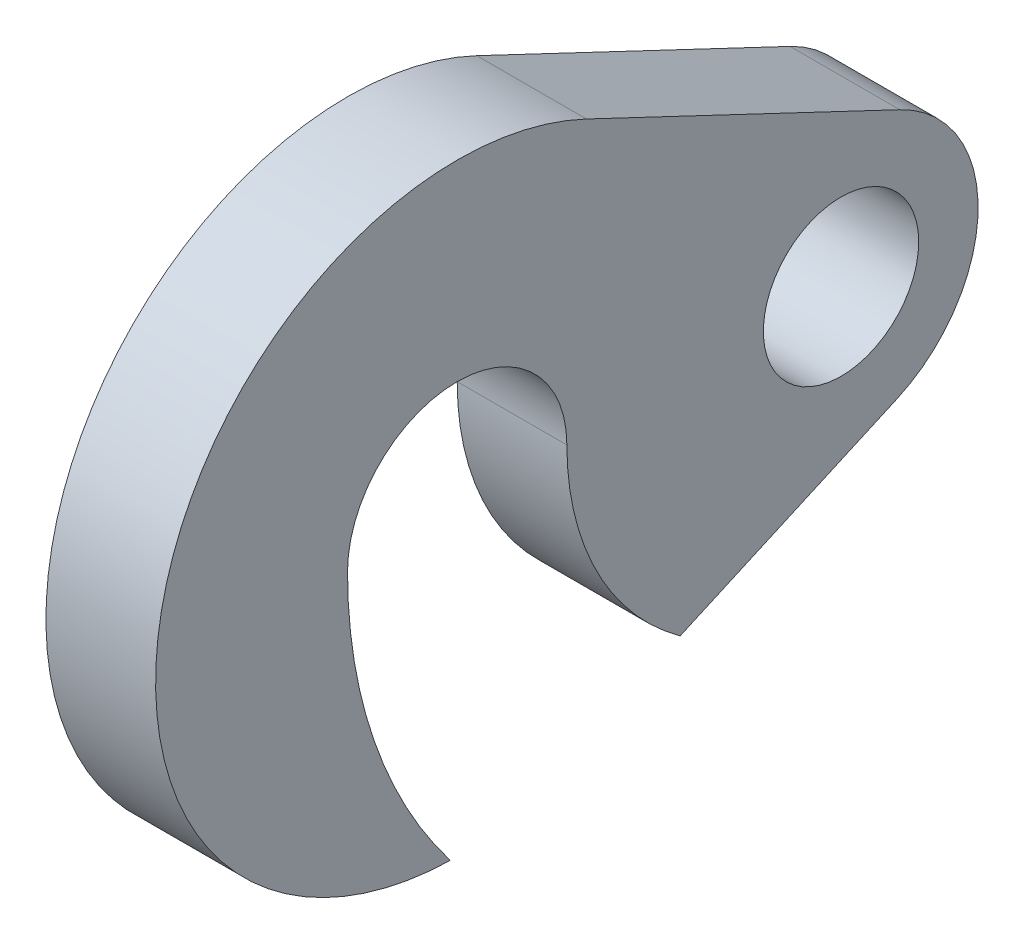
ISO-10303-21;
HEADER;
FILE_DESCRIPTION(('STEP AP214'),'2;1');
FILE_NAME('part.step','',(''),(''),'','','');
FILE_SCHEMA(('AUTOMOTIVE_DESIGN { 1 0 10303 214 1 1 1 1 }'));
ENDSEC;
DATA;
#1=APPLICATION_CONTEXT('core data for automotive mechanical design processes');
#2=APPLICATION_PROTOCOL_DEFINITION('international standard','automotive_design',2000,#1);
#3=PRODUCT_CONTEXT('',#1,'mechanical');
#4=PRODUCT('Part','Part','',(#3));
#5=PRODUCT_RELATED_PRODUCT_CATEGORY('part','',(#4));
#6=PRODUCT_DEFINITION_FORMATION('','',#4);
#7=PRODUCT_DEFINITION_CONTEXT('part definition',#1,'design');
#8=PRODUCT_DEFINITION('design','',#6,#7);
#9=PRODUCT_DEFINITION_SHAPE('','',#8);
#10=(LENGTH_UNIT() NAMED_UNIT(*) SI_UNIT(.MILLI.,.METRE.));
#11=(NAMED_UNIT(*) PLANE_ANGLE_UNIT() SI_UNIT($,.RADIAN.));
#12=(NAMED_UNIT(*) SI_UNIT($,.STERADIAN.) SOLID_ANGLE_UNIT());
#13=UNCERTAINTY_MEASURE_WITH_UNIT(LENGTH_MEASURE(1.E-05),#10,'distance_accuracy_value','');
#14=(GEOMETRIC_REPRESENTATION_CONTEXT(3) GLOBAL_UNCERTAINTY_ASSIGNED_CONTEXT((#13)) GLOBAL_UNIT_ASSIGNED_CONTEXT((#10,
#11,#12)) REPRESENTATION_CONTEXT('',''));
#15=CARTESIAN_POINT('',(0.,0.,0.));
#16=DIRECTION('',(0.,0.,1.));
#17=DIRECTION('',(1.,0.,0.));
#18=AXIS2_PLACEMENT_3D('',#15,#16,#17);
#19=CARTESIAN_POINT('',(12.,0.,0.));
#20=DIRECTION('',(1.,0.,0.));
#21=DIRECTION('',(0.,0.,-1.));
#22=AXIS2_PLACEMENT_3D('',#19,#20,#21);
#23=PLANE('',#22);
#24=CARTESIAN_POINT('',(12.,0.,0.));
#25=DIRECTION('',(-1.,0.,0.));
#26=DIRECTION('',(0.,0.,-1.));
#27=AXIS2_PLACEMENT_3D('',#24,#25,#26);
#28=CIRCLE('',#27,54.);
#29=CARTESIAN_POINT('',(12.,-32.9914761718842,42.75));
#30=VERTEX_POINT('',#29);
#31=CARTESIAN_POINT('',(12.,0.,54.));
#32=VERTEX_POINT('',#31);
#33=EDGE_CURVE('E136',#30,#32,#28,.T.);
#34=ORIENTED_EDGE('',*,*,#33,.T.);
#35=CARTESIAN_POINT('',(12.,0.,42.));
#36=DIRECTION('',(-1.,0.,0.));
#37=DIRECTION('',(0.,0.,1.));
#38=AXIS2_PLACEMENT_3D('',#35,#36,#37);
#39=CIRCLE('',#38,12.);
#40=CARTESIAN_POINT('',(12.,0.,30.));
#41=VERTEX_POINT('',#40);
#42=EDGE_CURVE('E89',#32,#41,#39,.T.);
#43=ORIENTED_EDGE('',*,*,#42,.T.);
#44=CARTESIAN_POINT('',(12.,0.,0.));
#45=DIRECTION('',(1.,0.,0.));
#46=DIRECTION('',(0.,0.,-1.));
#47=AXIS2_PLACEMENT_3D('',#44,#45,#46);
#48=CIRCLE('',#47,30.);
#49=CARTESIAN_POINT('',(12.,-24.2941166704029,17.6010197205973));
#50=VERTEX_POINT('',#49);
#51=EDGE_CURVE('E148',#41,#50,#48,.T.);
#52=ORIENTED_EDGE('',*,*,#51,.T.);
#53=DIRECTION('',(0.,0.407960411292442,-0.912999618191652));
#54=VECTOR('',#53,1.);
#55=CARTESIAN_POINT('',(12.,-24.2941166704029,17.6010197205973));
#56=LINE('',#55,#54);
#57=CARTESIAN_POINT('',(12.,-13.6949942728748,-6.11940616938663));
#58=VERTEX_POINT('',#57);
#59=EDGE_CURVE('E105',#50,#58,#56,.T.);
#60=ORIENTED_EDGE('',*,*,#59,.T.);
#61=CARTESIAN_POINT('',(12.,0.,0.));
#62=DIRECTION('',(1.,0.,0.));
#63=DIRECTION('',(0.,0.,1.));
#64=AXIS2_PLACEMENT_3D('',#61,#62,#63);
#65=CIRCLE('',#64,15.);
#66=CARTESIAN_POINT('',(12.,13.5526185435788,-6.42857142857143));
#67=VERTEX_POINT('',#66);
#68=EDGE_CURVE('E99',#58,#67,#65,.T.);
#69=ORIENTED_EDGE('',*,*,#68,.T.);
#70=DIRECTION('',(0.,0.428571428571429,0.903507902905251));
#71=VECTOR('',#70,1.);
#72=CARTESIAN_POINT('',(12.,29.8157607958733,27.8571428571428));
#73=LINE('',#72,#71);
#74=CARTESIAN_POINT('',(12.,29.8157607958733,27.8571428571428));
#75=VERTEX_POINT('',#74);
#76=EDGE_CURVE('E103',#67,#75,#73,.T.);
#77=ORIENTED_EDGE('',*,*,#76,.T.);
#78=CARTESIAN_POINT('',(12.,0.,42.));
#79=DIRECTION('',(1.,0.,0.));
#80=DIRECTION('',(0.,0.,-1.));
#81=AXIS2_PLACEMENT_3D('',#78,#79,#80);
#82=CIRCLE('',#81,33.);
#83=EDGE_CURVE('E49',#75,#30,#82,.T.);
#84=ORIENTED_EDGE('',*,*,#83,.T.);
#85=EDGE_LOOP('',(#34,#43,#52,#60,#69,#77,#84));
#86=FACE_BOUND('',#85,.T.);
#87=CARTESIAN_POINT('',(12.,0.,0.));
#88=DIRECTION('',(1.,0.,0.));
#89=DIRECTION('',(0.,0.,-1.));
#90=AXIS2_PLACEMENT_3D('',#87,#88,#89);
#91=CIRCLE('',#90,8.5);
#92=CARTESIAN_POINT('',(12.,0.,-8.5));
#93=VERTEX_POINT('',#92);
#94=EDGE_CURVE('E127',#93,#93,#91,.T.);
#95=ORIENTED_EDGE('',*,*,#94,.F.);
#96=EDGE_LOOP('',(#95));
#97=FACE_BOUND('',#96,.T.);
#98=ADVANCED_FACE('F32',(#86,#97),#23,.T.);
#99=CARTESIAN_POINT('',(0.,0.,0.));
#100=DIRECTION('',(1.,0.,0.));
#101=DIRECTION('',(0.,0.,-1.));
#102=AXIS2_PLACEMENT_3D('',#99,#100,#101);
#103=PLANE('',#102);
#104=CARTESIAN_POINT('',(0.,0.,0.));
#105=DIRECTION('',(-1.,0.,0.));
#106=DIRECTION('',(0.,0.,-1.));
#107=AXIS2_PLACEMENT_3D('',#104,#105,#106);
#108=CIRCLE('',#107,54.);
#109=CARTESIAN_POINT('',(0.,-32.9914761718842,42.75));
#110=VERTEX_POINT('',#109);
#111=CARTESIAN_POINT('',(0.,0.,54.));
#112=VERTEX_POINT('',#111);
#113=EDGE_CURVE('E123',#110,#112,#108,.T.);
#114=ORIENTED_EDGE('',*,*,#113,.F.);
#115=CARTESIAN_POINT('',(0.,0.,42.));
#116=DIRECTION('',(1.,0.,0.));
#117=DIRECTION('',(0.,0.,-1.));
#118=AXIS2_PLACEMENT_3D('',#115,#116,#117);
#119=CIRCLE('',#118,33.);
#120=CARTESIAN_POINT('',(0.,29.8157607958733,27.8571428571428));
#121=VERTEX_POINT('',#120);
#122=EDGE_CURVE('E81',#121,#110,#119,.T.);
#123=ORIENTED_EDGE('',*,*,#122,.F.);
#124=DIRECTION('',(0.,0.428571428571429,0.903507902905251));
#125=VECTOR('',#124,1.);
#126=CARTESIAN_POINT('',(0.,29.8157607958733,27.8571428571428));
#127=LINE('',#126,#125);
#128=CARTESIAN_POINT('',(0.,13.5526185435788,-6.42857142857143));
#129=VERTEX_POINT('',#128);
#130=EDGE_CURVE('E75',#129,#121,#127,.T.);
#131=ORIENTED_EDGE('',*,*,#130,.F.);
#132=CARTESIAN_POINT('',(0.,0.,0.));
#133=DIRECTION('',(1.,0.,0.));
#134=DIRECTION('',(0.,0.,1.));
#135=AXIS2_PLACEMENT_3D('',#132,#133,#134);
#136=CIRCLE('',#135,15.);
#137=CARTESIAN_POINT('',(0.,-13.6949942728748,-6.11940616938663));
#138=VERTEX_POINT('',#137);
#139=EDGE_CURVE('E113',#138,#129,#136,.T.);
#140=ORIENTED_EDGE('',*,*,#139,.F.);
#141=DIRECTION('',(0.,0.407960411292442,-0.912999618191652));
#142=VECTOR('',#141,1.);
#143=CARTESIAN_POINT('',(0.,-24.2941166704029,17.6010197205973));
#144=LINE('',#143,#142);
#145=CARTESIAN_POINT('',(0.,-24.2941166704029,17.6010197205973));
#146=VERTEX_POINT('',#145);
#147=EDGE_CURVE('E131',#146,#138,#144,.T.);
#148=ORIENTED_EDGE('',*,*,#147,.F.);
#149=CARTESIAN_POINT('',(0.,0.,0.));
#150=DIRECTION('',(1.,0.,0.));
#151=DIRECTION('',(0.,0.,-1.));
#152=AXIS2_PLACEMENT_3D('',#149,#150,#151);
#153=CIRCLE('',#152,30.);
#154=CARTESIAN_POINT('',(0.,0.,30.));
#155=VERTEX_POINT('',#154);
#156=EDGE_CURVE('E129',#155,#146,#153,.T.);
#157=ORIENTED_EDGE('',*,*,#156,.F.);
#158=CARTESIAN_POINT('',(0.,0.,42.));
#159=DIRECTION('',(-1.,0.,0.));
#160=DIRECTION('',(0.,0.,1.));
#161=AXIS2_PLACEMENT_3D('',#158,#159,#160);
#162=CIRCLE('',#161,12.);
#163=EDGE_CURVE('E126',#112,#155,#162,.T.);
#164=ORIENTED_EDGE('',*,*,#163,.F.);
#165=EDGE_LOOP('',(#114,#123,#131,#140,#148,#157,#164));
#166=FACE_BOUND('',#165,.T.);
#167=CARTESIAN_POINT('',(0.,0.,0.));
#168=DIRECTION('',(1.,0.,0.));
#169=DIRECTION('',(0.,0.,-1.));
#170=AXIS2_PLACEMENT_3D('',#167,#168,#169);
#171=CIRCLE('',#170,8.5);
#172=CARTESIAN_POINT('',(0.,0.,-8.5));
#173=VERTEX_POINT('',#172);
#174=EDGE_CURVE('E160',#173,#173,#171,.T.);
#175=ORIENTED_EDGE('',*,*,#174,.T.);
#176=EDGE_LOOP('',(#175));
#177=FACE_BOUND('',#176,.T.);
#178=ADVANCED_FACE('F152',(#166,#177),#103,.F.);
#179=CARTESIAN_POINT('',(12.,0.,0.));
#180=DIRECTION('',(-1.,0.,0.));
#181=DIRECTION('',(0.,0.,1.));
#182=AXIS2_PLACEMENT_3D('',#179,#180,#181);
#183=CYLINDRICAL_SURFACE('',#182,54.);
#184=ORIENTED_EDGE('',*,*,#113,.T.);
#185=DIRECTION('',(-1.,0.,0.));
#186=VECTOR('',#185,1.);
#187=CARTESIAN_POINT('',(12.,0.,54.));
#188=LINE('',#187,#186);
#189=EDGE_CURVE('E11',#32,#112,#188,.T.);
#190=ORIENTED_EDGE('',*,*,#189,.F.);
#191=ORIENTED_EDGE('',*,*,#33,.F.);
#192=DIRECTION('',(-1.,0.,0.));
#193=VECTOR('',#192,1.);
#194=CARTESIAN_POINT('',(12.,-32.9914761718842,42.75));
#195=LINE('',#194,#193);
#196=EDGE_CURVE('E119',#30,#110,#195,.T.);
#197=ORIENTED_EDGE('',*,*,#196,.T.);
#198=EDGE_LOOP('',(#184,#190,#191,#197));
#199=FACE_BOUND('',#198,.T.);
#200=ADVANCED_FACE('F34',(#199),#183,.F.);
#201=CARTESIAN_POINT('',(12.,0.,42.));
#202=DIRECTION('',(-1.,0.,0.));
#203=DIRECTION('',(0.,0.,1.));
#204=AXIS2_PLACEMENT_3D('',#201,#202,#203);
#205=CYLINDRICAL_SURFACE('',#204,12.);
#206=ORIENTED_EDGE('',*,*,#163,.T.);
#207=DIRECTION('',(-1.,0.,0.));
#208=VECTOR('',#207,1.);
#209=CARTESIAN_POINT('',(12.,0.,30.));
#210=LINE('',#209,#208);
#211=EDGE_CURVE('E41',#41,#155,#210,.T.);
#212=ORIENTED_EDGE('',*,*,#211,.F.);
#213=ORIENTED_EDGE('',*,*,#42,.F.);
#214=ORIENTED_EDGE('',*,*,#189,.T.);
#215=EDGE_LOOP('',(#206,#212,#213,#214));
#216=FACE_BOUND('',#215,.T.);
#217=ADVANCED_FACE('F186',(#216),#205,.F.);
#218=CARTESIAN_POINT('',(12.,0.,0.));
#219=DIRECTION('',(-1.,0.,0.));
#220=DIRECTION('',(0.,0.,1.));
#221=AXIS2_PLACEMENT_3D('',#218,#219,#220);
#222=CYLINDRICAL_SURFACE('',#221,30.);
#223=ORIENTED_EDGE('',*,*,#156,.T.);
#224=DIRECTION('',(-1.,0.,0.));
#225=VECTOR('',#224,1.);
#226=CARTESIAN_POINT('',(12.,-24.2941166704029,17.6010197205973));
#227=LINE('',#226,#225);
#228=EDGE_CURVE('E140',#50,#146,#227,.T.);
#229=ORIENTED_EDGE('',*,*,#228,.F.);
#230=ORIENTED_EDGE('',*,*,#51,.F.);
#231=ORIENTED_EDGE('',*,*,#211,.T.);
#232=EDGE_LOOP('',(#223,#229,#230,#231));
#233=FACE_BOUND('',#232,.T.);
#234=ADVANCED_FACE('F146',(#233),#222,.T.);
#235=CARTESIAN_POINT('',(12.,-24.2941166704029,17.6010197205973));
#236=DIRECTION('',(0.,0.912999618191651,0.407960411292442));
#237=DIRECTION('',(0.,-0.407960411292442,0.912999618191652));
#238=AXIS2_PLACEMENT_3D('',#235,#236,#237);
#239=PLANE('',#238);
#240=ORIENTED_EDGE('',*,*,#147,.T.);
#241=DIRECTION('',(-1.,0.,0.));
#242=VECTOR('',#241,1.);
#243=CARTESIAN_POINT('',(12.,-13.6949942728748,-6.11940616938663));
#244=LINE('',#243,#242);
#245=EDGE_CURVE('E114',#58,#138,#244,.T.);
#246=ORIENTED_EDGE('',*,*,#245,.F.);
#247=ORIENTED_EDGE('',*,*,#59,.F.);
#248=ORIENTED_EDGE('',*,*,#228,.T.);
#249=EDGE_LOOP('',(#240,#246,#247,#248));
#250=FACE_BOUND('',#249,.T.);
#251=ADVANCED_FACE('F155',(#250),#239,.F.);
#252=CARTESIAN_POINT('',(12.,0.,0.));
#253=DIRECTION('',(-1.,0.,0.));
#254=DIRECTION('',(0.,0.,1.));
#255=AXIS2_PLACEMENT_3D('',#252,#253,#254);
#256=CYLINDRICAL_SURFACE('',#255,15.);
#257=ORIENTED_EDGE('',*,*,#139,.T.);
#258=DIRECTION('',(-1.,0.,0.));
#259=VECTOR('',#258,1.);
#260=CARTESIAN_POINT('',(12.,13.5526185435788,-6.42857142857143));
#261=LINE('',#260,#259);
#262=EDGE_CURVE('E110',#67,#129,#261,.T.);
#263=ORIENTED_EDGE('',*,*,#262,.F.);
#264=ORIENTED_EDGE('',*,*,#68,.F.);
#265=ORIENTED_EDGE('',*,*,#245,.T.);
#266=EDGE_LOOP('',(#257,#263,#264,#265));
#267=FACE_BOUND('',#266,.T.);
#268=ADVANCED_FACE('F111',(#267),#256,.T.);
#269=CARTESIAN_POINT('',(12.,29.8157607958733,27.8571428571428));
#270=DIRECTION('',(0.,-0.903507902905251,0.428571428571429));
#271=DIRECTION('',(0.,-0.428571428571429,-0.903507902905251));
#272=AXIS2_PLACEMENT_3D('',#269,#270,#271);
#273=PLANE('',#272);
#274=ORIENTED_EDGE('',*,*,#130,.T.);
#275=DIRECTION('',(-1.,0.,0.));
#276=VECTOR('',#275,1.);
#277=CARTESIAN_POINT('',(12.,29.8157607958733,27.8571428571428));
#278=LINE('',#277,#276);
#279=EDGE_CURVE('E115',#75,#121,#278,.T.);
#280=ORIENTED_EDGE('',*,*,#279,.F.);
#281=ORIENTED_EDGE('',*,*,#76,.F.);
#282=ORIENTED_EDGE('',*,*,#262,.T.);
#283=EDGE_LOOP('',(#274,#280,#281,#282));
#284=FACE_BOUND('',#283,.T.);
#285=ADVANCED_FACE('F117',(#284),#273,.F.);
#286=CARTESIAN_POINT('',(12.,0.,42.));
#287=DIRECTION('',(-1.,0.,0.));
#288=DIRECTION('',(0.,0.,1.));
#289=AXIS2_PLACEMENT_3D('',#286,#287,#288);
#290=CYLINDRICAL_SURFACE('',#289,33.);
#291=ORIENTED_EDGE('',*,*,#122,.T.);
#292=ORIENTED_EDGE('',*,*,#196,.F.);
#293=ORIENTED_EDGE('',*,*,#83,.F.);
#294=ORIENTED_EDGE('',*,*,#279,.T.);
#295=EDGE_LOOP('',(#291,#292,#293,#294));
#296=FACE_BOUND('',#295,.T.);
#297=ADVANCED_FACE('F176',(#296),#290,.T.);
#298=CARTESIAN_POINT('',(12.,0.,0.));
#299=DIRECTION('',(-1.,0.,0.));
#300=DIRECTION('',(0.,0.,1.));
#301=AXIS2_PLACEMENT_3D('',#298,#299,#300);
#302=CYLINDRICAL_SURFACE('',#301,8.5);
#303=ORIENTED_EDGE('',*,*,#94,.T.);
#304=EDGE_LOOP('',(#303));
#305=FACE_BOUND('',#304,.T.);
#306=ORIENTED_EDGE('',*,*,#174,.F.);
#307=EDGE_LOOP('',(#306));
#308=FACE_BOUND('',#307,.T.);
#309=ADVANCED_FACE('F166',(#305,#308),#302,.F.);
#310=CLOSED_SHELL('',(#98,#178,#200,#217,#234,#251,#268,#285,#297,#309));
#311=MANIFOLD_SOLID_BREP('B2',#310);
#312=ADVANCED_BREP_SHAPE_REPRESENTATION('',(#18,#311),#14);
#313=SHAPE_DEFINITION_REPRESENTATION(#9,#312);
ENDSEC;
END-ISO-10303-21;
